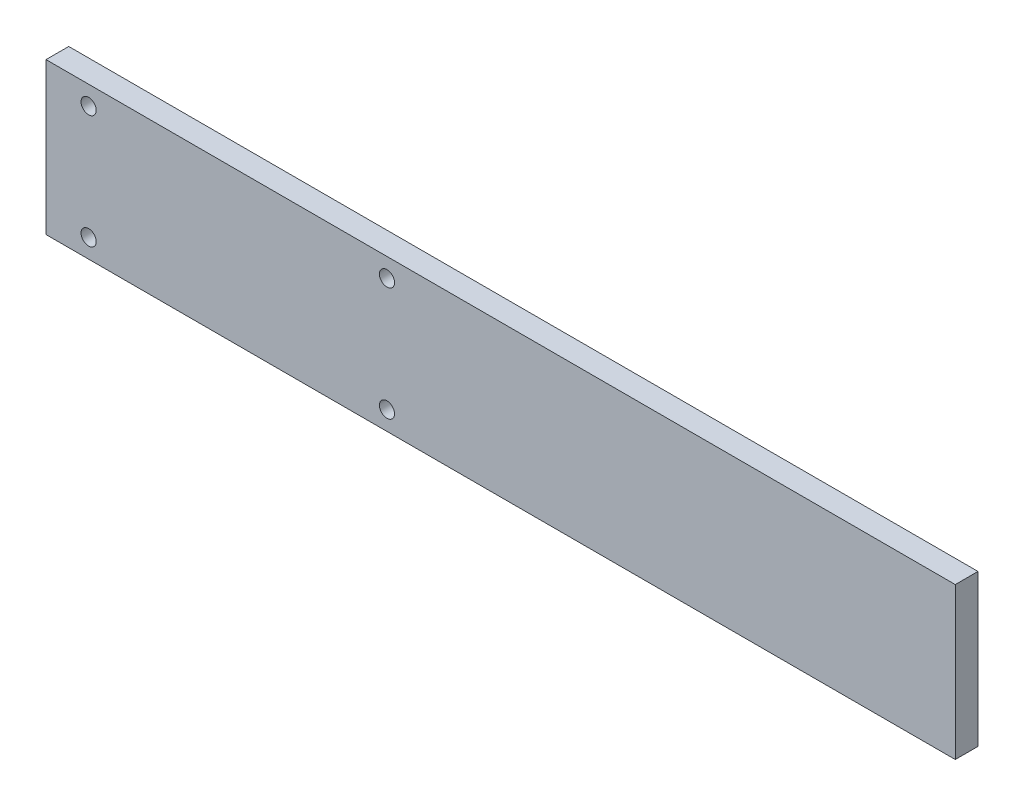
ISO-10303-21;
HEADER;
FILE_DESCRIPTION(('STEP AP214'),'2;1');
FILE_NAME('part.step','',(''),(''),'','','');
FILE_SCHEMA(('AUTOMOTIVE_DESIGN { 1 0 10303 214 1 1 1 1 }'));
ENDSEC;
DATA;
#1=APPLICATION_CONTEXT('core data for automotive mechanical design processes');
#2=APPLICATION_PROTOCOL_DEFINITION('international standard','automotive_design',2000,#1);
#3=PRODUCT_CONTEXT('',#1,'mechanical');
#4=PRODUCT('Part','Part','',(#3));
#5=PRODUCT_RELATED_PRODUCT_CATEGORY('part','',(#4));
#6=PRODUCT_DEFINITION_FORMATION('','',#4);
#7=PRODUCT_DEFINITION_CONTEXT('part definition',#1,'design');
#8=PRODUCT_DEFINITION('design','',#6,#7);
#9=PRODUCT_DEFINITION_SHAPE('','',#8);
#10=(LENGTH_UNIT() NAMED_UNIT(*) SI_UNIT(.MILLI.,.METRE.));
#11=(NAMED_UNIT(*) PLANE_ANGLE_UNIT() SI_UNIT($,.RADIAN.));
#12=(NAMED_UNIT(*) SI_UNIT($,.STERADIAN.) SOLID_ANGLE_UNIT());
#13=UNCERTAINTY_MEASURE_WITH_UNIT(LENGTH_MEASURE(1.E-05),#10,'distance_accuracy_value','');
#14=(GEOMETRIC_REPRESENTATION_CONTEXT(3) GLOBAL_UNCERTAINTY_ASSIGNED_CONTEXT((#13)) GLOBAL_UNIT_ASSIGNED_CONTEXT((#10,
#11,#12)) REPRESENTATION_CONTEXT('',''));
#15=CARTESIAN_POINT('',(0.,0.,0.));
#16=DIRECTION('',(0.,0.,1.));
#17=DIRECTION('',(1.,0.,0.));
#18=AXIS2_PLACEMENT_3D('',#15,#16,#17);
#19=CARTESIAN_POINT('',(-1524.,254.,76.2));
#20=DIRECTION('',(1.,0.,0.));
#21=DIRECTION('',(0.,0.,-1.));
#22=AXIS2_PLACEMENT_3D('',#19,#20,#21);
#23=PLANE('',#22);
#24=DIRECTION('',(0.,-1.,0.));
#25=VECTOR('',#24,1.);
#26=CARTESIAN_POINT('',(-1524.,254.,0.));
#27=LINE('',#26,#25);
#28=CARTESIAN_POINT('',(-1524.,254.,0.));
#29=VERTEX_POINT('',#28);
#30=CARTESIAN_POINT('',(-1524.,-254.,0.));
#31=VERTEX_POINT('',#30);
#32=EDGE_CURVE('E113',#29,#31,#27,.T.);
#33=ORIENTED_EDGE('',*,*,#32,.T.);
#34=DIRECTION('',(0.,0.,-1.));
#35=VECTOR('',#34,1.);
#36=CARTESIAN_POINT('',(-1524.,-254.,76.2));
#37=LINE('',#36,#35);
#38=CARTESIAN_POINT('',(-1524.,-254.,76.2));
#39=VERTEX_POINT('',#38);
#40=EDGE_CURVE('E11',#39,#31,#37,.T.);
#41=ORIENTED_EDGE('',*,*,#40,.F.);
#42=DIRECTION('',(0.,-1.,0.));
#43=VECTOR('',#42,1.);
#44=CARTESIAN_POINT('',(-1524.,254.,76.2));
#45=LINE('',#44,#43);
#46=CARTESIAN_POINT('',(-1524.,254.,76.2));
#47=VERTEX_POINT('',#46);
#48=EDGE_CURVE('E98',#47,#39,#45,.T.);
#49=ORIENTED_EDGE('',*,*,#48,.F.);
#50=DIRECTION('',(0.,0.,-1.));
#51=VECTOR('',#50,1.);
#52=CARTESIAN_POINT('',(-1524.,254.,76.2));
#53=LINE('',#52,#51);
#54=EDGE_CURVE('E112',#47,#29,#53,.T.);
#55=ORIENTED_EDGE('',*,*,#54,.T.);
#56=EDGE_LOOP('',(#33,#41,#49,#55));
#57=FACE_BOUND('',#56,.T.);
#58=ADVANCED_FACE('F50',(#57),#23,.F.);
#59=CARTESIAN_POINT('',(1524.,-254.,76.2));
#60=DIRECTION('',(0.,1.,0.));
#61=DIRECTION('',(-1.,0.,0.));
#62=AXIS2_PLACEMENT_3D('',#59,#60,#61);
#63=PLANE('',#62);
#64=DIRECTION('',(1.,0.,0.));
#65=VECTOR('',#64,1.);
#66=CARTESIAN_POINT('',(1524.,-254.,0.));
#67=LINE('',#66,#65);
#68=CARTESIAN_POINT('',(1524.,-254.,0.));
#69=VERTEX_POINT('',#68);
#70=EDGE_CURVE('E101',#31,#69,#67,.T.);
#71=ORIENTED_EDGE('',*,*,#70,.T.);
#72=DIRECTION('',(0.,0.,-1.));
#73=VECTOR('',#72,1.);
#74=CARTESIAN_POINT('',(1524.,-254.,76.2));
#75=LINE('',#74,#73);
#76=CARTESIAN_POINT('',(1524.,-254.,76.2));
#77=VERTEX_POINT('',#76);
#78=EDGE_CURVE('E57',#77,#69,#75,.T.);
#79=ORIENTED_EDGE('',*,*,#78,.F.);
#80=DIRECTION('',(1.,0.,0.));
#81=VECTOR('',#80,1.);
#82=CARTESIAN_POINT('',(1524.,-254.,76.2));
#83=LINE('',#82,#81);
#84=EDGE_CURVE('E92',#39,#77,#83,.T.);
#85=ORIENTED_EDGE('',*,*,#84,.F.);
#86=ORIENTED_EDGE('',*,*,#40,.T.);
#87=EDGE_LOOP('',(#71,#79,#85,#86));
#88=FACE_BOUND('',#87,.T.);
#89=ADVANCED_FACE('F104',(#88),#63,.F.);
#90=CARTESIAN_POINT('',(1524.,254.,76.2));
#91=DIRECTION('',(-1.,0.,0.));
#92=DIRECTION('',(0.,-1.,0.));
#93=AXIS2_PLACEMENT_3D('',#90,#91,#92);
#94=PLANE('',#93);
#95=DIRECTION('',(0.,1.,0.));
#96=VECTOR('',#95,1.);
#97=CARTESIAN_POINT('',(1524.,254.,0.));
#98=LINE('',#97,#96);
#99=CARTESIAN_POINT('',(1524.,254.,0.));
#100=VERTEX_POINT('',#99);
#101=EDGE_CURVE('E83',#69,#100,#98,.T.);
#102=ORIENTED_EDGE('',*,*,#101,.T.);
#103=DIRECTION('',(0.,0.,-1.));
#104=VECTOR('',#103,1.);
#105=CARTESIAN_POINT('',(1524.,254.,76.2));
#106=LINE('',#105,#104);
#107=CARTESIAN_POINT('',(1524.,254.,76.2));
#108=VERTEX_POINT('',#107);
#109=EDGE_CURVE('E107',#108,#100,#106,.T.);
#110=ORIENTED_EDGE('',*,*,#109,.F.);
#111=DIRECTION('',(0.,1.,0.));
#112=VECTOR('',#111,1.);
#113=CARTESIAN_POINT('',(1524.,254.,76.2));
#114=LINE('',#113,#112);
#115=EDGE_CURVE('E100',#77,#108,#114,.T.);
#116=ORIENTED_EDGE('',*,*,#115,.F.);
#117=ORIENTED_EDGE('',*,*,#78,.T.);
#118=EDGE_LOOP('',(#102,#110,#116,#117));
#119=FACE_BOUND('',#118,.T.);
#120=ADVANCED_FACE('F110',(#119),#94,.F.);
#121=CARTESIAN_POINT('',(1524.,254.,76.2));
#122=DIRECTION('',(0.,-1.,0.));
#123=DIRECTION('',(1.,0.,0.));
#124=AXIS2_PLACEMENT_3D('',#121,#122,#123);
#125=PLANE('',#124);
#126=DIRECTION('',(-1.,0.,0.));
#127=VECTOR('',#126,1.);
#128=CARTESIAN_POINT('',(1524.,254.,0.));
#129=LINE('',#128,#127);
#130=EDGE_CURVE('E90',#100,#29,#129,.T.);
#131=ORIENTED_EDGE('',*,*,#130,.T.);
#132=ORIENTED_EDGE('',*,*,#54,.F.);
#133=DIRECTION('',(-1.,0.,0.));
#134=VECTOR('',#133,1.);
#135=CARTESIAN_POINT('',(1524.,254.,76.2));
#136=LINE('',#135,#134);
#137=EDGE_CURVE('E64',#108,#47,#136,.T.);
#138=ORIENTED_EDGE('',*,*,#137,.F.);
#139=ORIENTED_EDGE('',*,*,#109,.T.);
#140=EDGE_LOOP('',(#131,#132,#138,#139));
#141=FACE_BOUND('',#140,.T.);
#142=ADVANCED_FACE('F129',(#141),#125,.F.);
#143=CARTESIAN_POINT('',(0.,0.,76.2));
#144=DIRECTION('',(0.,0.,-1.));
#145=DIRECTION('',(-1.,0.,0.));
#146=AXIS2_PLACEMENT_3D('',#143,#144,#145);
#147=PLANE('',#146);
#148=CARTESIAN_POINT('',(-1381.125,-190.5,76.2));
#149=DIRECTION('',(0.,0.,1.));
#150=DIRECTION('',(1.,0.,0.));
#151=AXIS2_PLACEMENT_3D('',#148,#149,#150);
#152=CIRCLE('',#151,25.4);
#153=CARTESIAN_POINT('',(-1355.725,-190.5,76.2));
#154=VERTEX_POINT('',#153);
#155=EDGE_CURVE('E139',#154,#154,#152,.T.);
#156=ORIENTED_EDGE('',*,*,#155,.F.);
#157=EDGE_LOOP('',(#156));
#158=FACE_BOUND('',#157,.T.);
#159=CARTESIAN_POINT('',(-381.,190.5,76.2));
#160=DIRECTION('',(0.,0.,1.));
#161=DIRECTION('',(-1.,0.,0.));
#162=AXIS2_PLACEMENT_3D('',#159,#160,#161);
#163=CIRCLE('',#162,25.4);
#164=CARTESIAN_POINT('',(-355.6,190.5,76.2));
#165=VERTEX_POINT('',#164);
#166=EDGE_CURVE('E149',#165,#165,#163,.T.);
#167=ORIENTED_EDGE('',*,*,#166,.F.);
#168=EDGE_LOOP('',(#167));
#169=FACE_BOUND('',#168,.T.);
#170=CARTESIAN_POINT('',(-1381.125,190.5,76.2));
#171=DIRECTION('',(0.,0.,1.));
#172=DIRECTION('',(-1.,0.,0.));
#173=AXIS2_PLACEMENT_3D('',#170,#171,#172);
#174=CIRCLE('',#173,25.4);
#175=CARTESIAN_POINT('',(-1355.725,190.5,76.2));
#176=VERTEX_POINT('',#175);
#177=EDGE_CURVE('E146',#176,#176,#174,.T.);
#178=ORIENTED_EDGE('',*,*,#177,.F.);
#179=EDGE_LOOP('',(#178));
#180=FACE_BOUND('',#179,.T.);
#181=CARTESIAN_POINT('',(-381.,-190.5,76.2));
#182=DIRECTION('',(0.,0.,1.));
#183=DIRECTION('',(1.,0.,0.));
#184=AXIS2_PLACEMENT_3D('',#181,#182,#183);
#185=CIRCLE('',#184,25.4);
#186=CARTESIAN_POINT('',(-355.6,-190.5,76.2));
#187=VERTEX_POINT('',#186);
#188=EDGE_CURVE('E136',#187,#187,#185,.T.);
#189=ORIENTED_EDGE('',*,*,#188,.F.);
#190=EDGE_LOOP('',(#189));
#191=FACE_BOUND('',#190,.T.);
#192=ORIENTED_EDGE('',*,*,#48,.T.);
#193=ORIENTED_EDGE('',*,*,#84,.T.);
#194=ORIENTED_EDGE('',*,*,#115,.T.);
#195=ORIENTED_EDGE('',*,*,#137,.T.);
#196=EDGE_LOOP('',(#192,#193,#194,#195));
#197=FACE_BOUND('',#196,.T.);
#198=ADVANCED_FACE('F94',(#158,#169,#180,#191,#197),#147,.F.);
#199=CARTESIAN_POINT('',(0.,0.,0.));
#200=DIRECTION('',(0.,0.,-1.));
#201=DIRECTION('',(-1.,0.,0.));
#202=AXIS2_PLACEMENT_3D('',#199,#200,#201);
#203=PLANE('',#202);
#204=CARTESIAN_POINT('',(-1381.125,-190.5,0.));
#205=DIRECTION('',(0.,0.,1.));
#206=DIRECTION('',(1.,0.,0.));
#207=AXIS2_PLACEMENT_3D('',#204,#205,#206);
#208=CIRCLE('',#207,25.4);
#209=CARTESIAN_POINT('',(-1355.725,-190.5,0.));
#210=VERTEX_POINT('',#209);
#211=EDGE_CURVE('E153',#210,#210,#208,.T.);
#212=ORIENTED_EDGE('',*,*,#211,.T.);
#213=EDGE_LOOP('',(#212));
#214=FACE_BOUND('',#213,.T.);
#215=CARTESIAN_POINT('',(-381.,190.5,0.));
#216=DIRECTION('',(0.,0.,1.));
#217=DIRECTION('',(-1.,0.,0.));
#218=AXIS2_PLACEMENT_3D('',#215,#216,#217);
#219=CIRCLE('',#218,25.4);
#220=CARTESIAN_POINT('',(-355.6,190.5,0.));
#221=VERTEX_POINT('',#220);
#222=EDGE_CURVE('E143',#221,#221,#219,.T.);
#223=ORIENTED_EDGE('',*,*,#222,.T.);
#224=EDGE_LOOP('',(#223));
#225=FACE_BOUND('',#224,.T.);
#226=CARTESIAN_POINT('',(-1381.125,190.5,0.));
#227=DIRECTION('',(0.,0.,1.));
#228=DIRECTION('',(-1.,0.,0.));
#229=AXIS2_PLACEMENT_3D('',#226,#227,#228);
#230=CIRCLE('',#229,25.4);
#231=CARTESIAN_POINT('',(-1355.725,190.5,0.));
#232=VERTEX_POINT('',#231);
#233=EDGE_CURVE('E158',#232,#232,#230,.T.);
#234=ORIENTED_EDGE('',*,*,#233,.T.);
#235=EDGE_LOOP('',(#234));
#236=FACE_BOUND('',#235,.T.);
#237=CARTESIAN_POINT('',(-381.,-190.5,0.));
#238=DIRECTION('',(0.,0.,1.));
#239=DIRECTION('',(1.,0.,0.));
#240=AXIS2_PLACEMENT_3D('',#237,#238,#239);
#241=CIRCLE('',#240,25.4);
#242=CARTESIAN_POINT('',(-355.6,-190.5,0.));
#243=VERTEX_POINT('',#242);
#244=EDGE_CURVE('E119',#243,#243,#241,.T.);
#245=ORIENTED_EDGE('',*,*,#244,.T.);
#246=EDGE_LOOP('',(#245));
#247=FACE_BOUND('',#246,.T.);
#248=ORIENTED_EDGE('',*,*,#32,.F.);
#249=ORIENTED_EDGE('',*,*,#130,.F.);
#250=ORIENTED_EDGE('',*,*,#101,.F.);
#251=ORIENTED_EDGE('',*,*,#70,.F.);
#252=EDGE_LOOP('',(#248,#249,#250,#251));
#253=FACE_BOUND('',#252,.T.);
#254=ADVANCED_FACE('F135',(#214,#225,#236,#247,#253),#203,.T.);
#255=CARTESIAN_POINT('',(-381.,-190.5,0.));
#256=DIRECTION('',(0.,0.,1.));
#257=DIRECTION('',(1.,0.,0.));
#258=AXIS2_PLACEMENT_3D('',#255,#256,#257);
#259=CYLINDRICAL_SURFACE('',#258,25.4);
#260=CARTESIAN_POINT('',(-355.6,-190.5,0.));
#261=CARTESIAN_POINT('',(-355.6,-190.5,0.79375));
#262=CARTESIAN_POINT('',(-355.6,-190.5,1.5875));
#263=CARTESIAN_POINT('',(-355.6,-190.5,3.175));
#264=CARTESIAN_POINT('',(-355.6,-190.5,3.96875));
#265=CARTESIAN_POINT('',(-355.6,-190.5,5.55625));
#266=CARTESIAN_POINT('',(-355.6,-190.5,6.35));
#267=CARTESIAN_POINT('',(-355.6,-190.5,7.9375));
#268=CARTESIAN_POINT('',(-355.6,-190.5,8.73125));
#269=CARTESIAN_POINT('',(-355.6,-190.5,10.31875));
#270=CARTESIAN_POINT('',(-355.6,-190.5,11.1125));
#271=CARTESIAN_POINT('',(-355.6,-190.5,12.7));
#272=CARTESIAN_POINT('',(-355.6,-190.5,13.49375));
#273=CARTESIAN_POINT('',(-355.6,-190.5,15.08125));
#274=CARTESIAN_POINT('',(-355.6,-190.5,15.875));
#275=CARTESIAN_POINT('',(-355.6,-190.5,17.4625));
#276=CARTESIAN_POINT('',(-355.6,-190.5,18.25625));
#277=CARTESIAN_POINT('',(-355.6,-190.5,19.84375));
#278=CARTESIAN_POINT('',(-355.6,-190.5,20.6375));
#279=CARTESIAN_POINT('',(-355.6,-190.5,22.225));
#280=CARTESIAN_POINT('',(-355.6,-190.5,23.01875));
#281=CARTESIAN_POINT('',(-355.6,-190.5,24.60625));
#282=CARTESIAN_POINT('',(-355.6,-190.5,25.4));
#283=CARTESIAN_POINT('',(-355.6,-190.5,26.9875));
#284=CARTESIAN_POINT('',(-355.6,-190.5,27.78125));
#285=CARTESIAN_POINT('',(-355.6,-190.5,29.36875));
#286=CARTESIAN_POINT('',(-355.6,-190.5,30.1625));
#287=CARTESIAN_POINT('',(-355.6,-190.5,31.75));
#288=CARTESIAN_POINT('',(-355.6,-190.5,32.54375));
#289=CARTESIAN_POINT('',(-355.6,-190.5,34.13125));
#290=CARTESIAN_POINT('',(-355.6,-190.5,34.925));
#291=CARTESIAN_POINT('',(-355.6,-190.5,36.5125));
#292=CARTESIAN_POINT('',(-355.6,-190.5,37.30625));
#293=CARTESIAN_POINT('',(-355.6,-190.5,38.89375));
#294=CARTESIAN_POINT('',(-355.6,-190.5,39.6875));
#295=CARTESIAN_POINT('',(-355.6,-190.5,41.275));
#296=CARTESIAN_POINT('',(-355.6,-190.5,42.06875));
#297=CARTESIAN_POINT('',(-355.6,-190.5,43.65625));
#298=CARTESIAN_POINT('',(-355.6,-190.5,44.45));
#299=CARTESIAN_POINT('',(-355.6,-190.5,46.0375));
#300=CARTESIAN_POINT('',(-355.6,-190.5,46.83125));
#301=CARTESIAN_POINT('',(-355.6,-190.5,48.41875));
#302=CARTESIAN_POINT('',(-355.6,-190.5,49.2125));
#303=CARTESIAN_POINT('',(-355.6,-190.5,50.8));
#304=CARTESIAN_POINT('',(-355.6,-190.5,51.59375));
#305=CARTESIAN_POINT('',(-355.6,-190.5,53.18125));
#306=CARTESIAN_POINT('',(-355.6,-190.5,53.975));
#307=CARTESIAN_POINT('',(-355.6,-190.5,55.5625));
#308=CARTESIAN_POINT('',(-355.6,-190.5,56.35625));
#309=CARTESIAN_POINT('',(-355.6,-190.5,57.94375));
#310=CARTESIAN_POINT('',(-355.6,-190.5,58.7375));
#311=CARTESIAN_POINT('',(-355.6,-190.5,60.325));
#312=CARTESIAN_POINT('',(-355.6,-190.5,61.11875));
#313=CARTESIAN_POINT('',(-355.6,-190.5,62.70625));
#314=CARTESIAN_POINT('',(-355.6,-190.5,63.5));
#315=CARTESIAN_POINT('',(-355.6,-190.5,65.0875));
#316=CARTESIAN_POINT('',(-355.6,-190.5,65.88125));
#317=CARTESIAN_POINT('',(-355.6,-190.5,67.46875));
#318=CARTESIAN_POINT('',(-355.6,-190.5,68.2625));
#319=CARTESIAN_POINT('',(-355.6,-190.5,69.85));
#320=CARTESIAN_POINT('',(-355.6,-190.5,70.64375));
#321=CARTESIAN_POINT('',(-355.6,-190.5,72.23125));
#322=CARTESIAN_POINT('',(-355.6,-190.5,73.025));
#323=CARTESIAN_POINT('',(-355.6,-190.5,74.6125));
#324=CARTESIAN_POINT('',(-355.6,-190.5,75.40625));
#325=CARTESIAN_POINT('',(-355.6,-190.5,76.2));
#326=B_SPLINE_CURVE_WITH_KNOTS('',3,(#260,#261,#262,#263,#264,#265,#266,#267,#268,#269,#270,
#271,#272,#273,#274,#275,#276,#277,#278,#279,#280,#281,#282,#283,#284,#285,#286,#287,#288,#289,
#290,#291,#292,#293,#294,#295,#296,#297,#298,#299,#300,#301,#302,#303,#304,#305,#306,#307,#308,
#309,#310,#311,#312,#313,#314,#315,#316,#317,#318,#319,#320,#321,#322,#323,#324,#325),
.UNSPECIFIED.,.F.,.F.,(4,2,2,2,2,2,2,2,2,2,2,2,2,2,2,2,2,2,2,2,2,2,2,2,2,2,2,2,2,2,2,2,4),(0.,
2.38125,4.7625,7.14375,9.525,11.90625,14.2875,16.66875,19.05,21.43125,23.8125,26.19375,28.575,
30.95625,33.3375,35.71875,38.1,40.48125,42.8625,45.24375,47.625,50.00625,52.3875,54.76875,57.15,
59.53125,61.9125,64.29375,66.675,69.05625,71.4375,73.81875,76.2),.UNSPECIFIED.);
#327=EDGE_CURVE('BSEAM176',#243,#187,#326,.T.);
#328=ORIENTED_EDGE('',*,*,#244,.F.);
#329=ORIENTED_EDGE('',*,*,#188,.T.);
#330=ORIENTED_EDGE('',*,*,#327,.T.);
#331=ORIENTED_EDGE('',*,*,#327,.F.);
#332=EDGE_LOOP('',(#328,#330,#329,#331));
#333=FACE_BOUND('',#332,.T.);
#334=ADVANCED_FACE('F176',(#333),#259,.F.);
#335=CARTESIAN_POINT('',(-1381.125,190.5,0.));
#336=DIRECTION('',(0.,0.,1.));
#337=DIRECTION('',(1.,0.,0.));
#338=AXIS2_PLACEMENT_3D('',#335,#336,#337);
#339=CYLINDRICAL_SURFACE('',#338,25.4);
#340=CARTESIAN_POINT('',(-1355.725,190.5,0.));
#341=CARTESIAN_POINT('',(-1355.725,190.5,0.79375));
#342=CARTESIAN_POINT('',(-1355.725,190.5,1.5875));
#343=CARTESIAN_POINT('',(-1355.725,190.5,3.175));
#344=CARTESIAN_POINT('',(-1355.725,190.5,3.96875));
#345=CARTESIAN_POINT('',(-1355.725,190.5,5.55625));
#346=CARTESIAN_POINT('',(-1355.725,190.5,6.35));
#347=CARTESIAN_POINT('',(-1355.725,190.5,7.9375));
#348=CARTESIAN_POINT('',(-1355.725,190.5,8.73125));
#349=CARTESIAN_POINT('',(-1355.725,190.5,10.31875));
#350=CARTESIAN_POINT('',(-1355.725,190.5,11.1125));
#351=CARTESIAN_POINT('',(-1355.725,190.5,12.7));
#352=CARTESIAN_POINT('',(-1355.725,190.5,13.49375));
#353=CARTESIAN_POINT('',(-1355.725,190.5,15.08125));
#354=CARTESIAN_POINT('',(-1355.725,190.5,15.875));
#355=CARTESIAN_POINT('',(-1355.725,190.5,17.4625));
#356=CARTESIAN_POINT('',(-1355.725,190.5,18.25625));
#357=CARTESIAN_POINT('',(-1355.725,190.5,19.84375));
#358=CARTESIAN_POINT('',(-1355.725,190.5,20.6375));
#359=CARTESIAN_POINT('',(-1355.725,190.5,22.225));
#360=CARTESIAN_POINT('',(-1355.725,190.5,23.01875));
#361=CARTESIAN_POINT('',(-1355.725,190.5,24.60625));
#362=CARTESIAN_POINT('',(-1355.725,190.5,25.4));
#363=CARTESIAN_POINT('',(-1355.725,190.5,26.9875));
#364=CARTESIAN_POINT('',(-1355.725,190.5,27.78125));
#365=CARTESIAN_POINT('',(-1355.725,190.5,29.36875));
#366=CARTESIAN_POINT('',(-1355.725,190.5,30.1625));
#367=CARTESIAN_POINT('',(-1355.725,190.5,31.75));
#368=CARTESIAN_POINT('',(-1355.725,190.5,32.54375));
#369=CARTESIAN_POINT('',(-1355.725,190.5,34.13125));
#370=CARTESIAN_POINT('',(-1355.725,190.5,34.925));
#371=CARTESIAN_POINT('',(-1355.725,190.5,36.5125));
#372=CARTESIAN_POINT('',(-1355.725,190.5,37.30625));
#373=CARTESIAN_POINT('',(-1355.725,190.5,38.89375));
#374=CARTESIAN_POINT('',(-1355.725,190.5,39.6875));
#375=CARTESIAN_POINT('',(-1355.725,190.5,41.275));
#376=CARTESIAN_POINT('',(-1355.725,190.5,42.06875));
#377=CARTESIAN_POINT('',(-1355.725,190.5,43.65625));
#378=CARTESIAN_POINT('',(-1355.725,190.5,44.45));
#379=CARTESIAN_POINT('',(-1355.725,190.5,46.0375));
#380=CARTESIAN_POINT('',(-1355.725,190.5,46.83125));
#381=CARTESIAN_POINT('',(-1355.725,190.5,48.41875));
#382=CARTESIAN_POINT('',(-1355.725,190.5,49.2125));
#383=CARTESIAN_POINT('',(-1355.725,190.5,50.8));
#384=CARTESIAN_POINT('',(-1355.725,190.5,51.59375));
#385=CARTESIAN_POINT('',(-1355.725,190.5,53.18125));
#386=CARTESIAN_POINT('',(-1355.725,190.5,53.975));
#387=CARTESIAN_POINT('',(-1355.725,190.5,55.5625));
#388=CARTESIAN_POINT('',(-1355.725,190.5,56.35625));
#389=CARTESIAN_POINT('',(-1355.725,190.5,57.94375));
#390=CARTESIAN_POINT('',(-1355.725,190.5,58.7375));
#391=CARTESIAN_POINT('',(-1355.725,190.5,60.325));
#392=CARTESIAN_POINT('',(-1355.725,190.5,61.11875));
#393=CARTESIAN_POINT('',(-1355.725,190.5,62.70625));
#394=CARTESIAN_POINT('',(-1355.725,190.5,63.5));
#395=CARTESIAN_POINT('',(-1355.725,190.5,65.0875));
#396=CARTESIAN_POINT('',(-1355.725,190.5,65.88125));
#397=CARTESIAN_POINT('',(-1355.725,190.5,67.46875));
#398=CARTESIAN_POINT('',(-1355.725,190.5,68.2625));
#399=CARTESIAN_POINT('',(-1355.725,190.5,69.85));
#400=CARTESIAN_POINT('',(-1355.725,190.5,70.64375));
#401=CARTESIAN_POINT('',(-1355.725,190.5,72.23125));
#402=CARTESIAN_POINT('',(-1355.725,190.5,73.025));
#403=CARTESIAN_POINT('',(-1355.725,190.5,74.6125));
#404=CARTESIAN_POINT('',(-1355.725,190.5,75.40625));
#405=CARTESIAN_POINT('',(-1355.725,190.5,76.2));
#406=B_SPLINE_CURVE_WITH_KNOTS('',3,(#340,#341,#342,#343,#344,#345,#346,#347,#348,#349,#350,
#351,#352,#353,#354,#355,#356,#357,#358,#359,#360,#361,#362,#363,#364,#365,#366,#367,#368,#369,
#370,#371,#372,#373,#374,#375,#376,#377,#378,#379,#380,#381,#382,#383,#384,#385,#386,#387,#388,
#389,#390,#391,#392,#393,#394,#395,#396,#397,#398,#399,#400,#401,#402,#403,#404,#405),
.UNSPECIFIED.,.F.,.F.,(4,2,2,2,2,2,2,2,2,2,2,2,2,2,2,2,2,2,2,2,2,2,2,2,2,2,2,2,2,2,2,2,4),(0.,
2.38125,4.7625,7.14375,9.525,11.90625,14.2875,16.66875,19.05,21.43125,23.8125,26.19375,28.575,
30.95625,33.3375,35.71875,38.1,40.48125,42.8625,45.24375,47.625,50.00625,52.3875,54.76875,57.15,
59.53125,61.9125,64.29375,66.675,69.05625,71.4375,73.81875,76.2),.UNSPECIFIED.);
#407=EDGE_CURVE('BSEAM166',#232,#176,#406,.T.);
#408=ORIENTED_EDGE('',*,*,#233,.F.);
#409=ORIENTED_EDGE('',*,*,#177,.T.);
#410=ORIENTED_EDGE('',*,*,#407,.T.);
#411=ORIENTED_EDGE('',*,*,#407,.F.);
#412=EDGE_LOOP('',(#408,#410,#409,#411));
#413=FACE_BOUND('',#412,.T.);
#414=ADVANCED_FACE('F166',(#413),#339,.F.);
#415=CARTESIAN_POINT('',(-381.,190.5,0.));
#416=DIRECTION('',(0.,0.,1.));
#417=DIRECTION('',(1.,0.,0.));
#418=AXIS2_PLACEMENT_3D('',#415,#416,#417);
#419=CYLINDRICAL_SURFACE('',#418,25.4);
#420=CARTESIAN_POINT('',(-355.6,190.5,0.));
#421=CARTESIAN_POINT('',(-355.6,190.5,0.79375));
#422=CARTESIAN_POINT('',(-355.6,190.5,1.5875));
#423=CARTESIAN_POINT('',(-355.6,190.5,3.175));
#424=CARTESIAN_POINT('',(-355.6,190.5,3.96875));
#425=CARTESIAN_POINT('',(-355.6,190.5,5.55625));
#426=CARTESIAN_POINT('',(-355.6,190.5,6.35));
#427=CARTESIAN_POINT('',(-355.6,190.5,7.9375));
#428=CARTESIAN_POINT('',(-355.6,190.5,8.73125));
#429=CARTESIAN_POINT('',(-355.6,190.5,10.31875));
#430=CARTESIAN_POINT('',(-355.6,190.5,11.1125));
#431=CARTESIAN_POINT('',(-355.6,190.5,12.7));
#432=CARTESIAN_POINT('',(-355.6,190.5,13.49375));
#433=CARTESIAN_POINT('',(-355.6,190.5,15.08125));
#434=CARTESIAN_POINT('',(-355.6,190.5,15.875));
#435=CARTESIAN_POINT('',(-355.6,190.5,17.4625));
#436=CARTESIAN_POINT('',(-355.6,190.5,18.25625));
#437=CARTESIAN_POINT('',(-355.6,190.5,19.84375));
#438=CARTESIAN_POINT('',(-355.6,190.5,20.6375));
#439=CARTESIAN_POINT('',(-355.6,190.5,22.225));
#440=CARTESIAN_POINT('',(-355.6,190.5,23.01875));
#441=CARTESIAN_POINT('',(-355.6,190.5,24.60625));
#442=CARTESIAN_POINT('',(-355.6,190.5,25.4));
#443=CARTESIAN_POINT('',(-355.6,190.5,26.9875));
#444=CARTESIAN_POINT('',(-355.6,190.5,27.78125));
#445=CARTESIAN_POINT('',(-355.6,190.5,29.36875));
#446=CARTESIAN_POINT('',(-355.6,190.5,30.1625));
#447=CARTESIAN_POINT('',(-355.6,190.5,31.75));
#448=CARTESIAN_POINT('',(-355.6,190.5,32.54375));
#449=CARTESIAN_POINT('',(-355.6,190.5,34.13125));
#450=CARTESIAN_POINT('',(-355.6,190.5,34.925));
#451=CARTESIAN_POINT('',(-355.6,190.5,36.5125));
#452=CARTESIAN_POINT('',(-355.6,190.5,37.30625));
#453=CARTESIAN_POINT('',(-355.6,190.5,38.89375));
#454=CARTESIAN_POINT('',(-355.6,190.5,39.6875));
#455=CARTESIAN_POINT('',(-355.6,190.5,41.275));
#456=CARTESIAN_POINT('',(-355.6,190.5,42.06875));
#457=CARTESIAN_POINT('',(-355.6,190.5,43.65625));
#458=CARTESIAN_POINT('',(-355.6,190.5,44.45));
#459=CARTESIAN_POINT('',(-355.6,190.5,46.0375));
#460=CARTESIAN_POINT('',(-355.6,190.5,46.83125));
#461=CARTESIAN_POINT('',(-355.6,190.5,48.41875));
#462=CARTESIAN_POINT('',(-355.6,190.5,49.2125));
#463=CARTESIAN_POINT('',(-355.6,190.5,50.8));
#464=CARTESIAN_POINT('',(-355.6,190.5,51.59375));
#465=CARTESIAN_POINT('',(-355.6,190.5,53.18125));
#466=CARTESIAN_POINT('',(-355.6,190.5,53.975));
#467=CARTESIAN_POINT('',(-355.6,190.5,55.5625));
#468=CARTESIAN_POINT('',(-355.6,190.5,56.35625));
#469=CARTESIAN_POINT('',(-355.6,190.5,57.94375));
#470=CARTESIAN_POINT('',(-355.6,190.5,58.7375));
#471=CARTESIAN_POINT('',(-355.6,190.5,60.325));
#472=CARTESIAN_POINT('',(-355.6,190.5,61.11875));
#473=CARTESIAN_POINT('',(-355.6,190.5,62.70625));
#474=CARTESIAN_POINT('',(-355.6,190.5,63.5));
#475=CARTESIAN_POINT('',(-355.6,190.5,65.0875));
#476=CARTESIAN_POINT('',(-355.6,190.5,65.88125));
#477=CARTESIAN_POINT('',(-355.6,190.5,67.46875));
#478=CARTESIAN_POINT('',(-355.6,190.5,68.2625));
#479=CARTESIAN_POINT('',(-355.6,190.5,69.85));
#480=CARTESIAN_POINT('',(-355.6,190.5,70.64375));
#481=CARTESIAN_POINT('',(-355.6,190.5,72.23125));
#482=CARTESIAN_POINT('',(-355.6,190.5,73.025));
#483=CARTESIAN_POINT('',(-355.6,190.5,74.6125));
#484=CARTESIAN_POINT('',(-355.6,190.5,75.40625));
#485=CARTESIAN_POINT('',(-355.6,190.5,76.2));
#486=B_SPLINE_CURVE_WITH_KNOTS('',3,(#420,#421,#422,#423,#424,#425,#426,#427,#428,#429,#430,
#431,#432,#433,#434,#435,#436,#437,#438,#439,#440,#441,#442,#443,#444,#445,#446,#447,#448,#449,
#450,#451,#452,#453,#454,#455,#456,#457,#458,#459,#460,#461,#462,#463,#464,#465,#466,#467,#468,
#469,#470,#471,#472,#473,#474,#475,#476,#477,#478,#479,#480,#481,#482,#483,#484,#485),
.UNSPECIFIED.,.F.,.F.,(4,2,2,2,2,2,2,2,2,2,2,2,2,2,2,2,2,2,2,2,2,2,2,2,2,2,2,2,2,2,2,2,4),(0.,
2.38125,4.7625,7.14375,9.525,11.90625,14.2875,16.66875,19.05,21.43125,23.8125,26.19375,28.575,
30.95625,33.3375,35.71875,38.1,40.48125,42.8625,45.24375,47.625,50.00625,52.3875,54.76875,57.15,
59.53125,61.9125,64.29375,66.675,69.05625,71.4375,73.81875,76.2),.UNSPECIFIED.);
#487=EDGE_CURVE('BSEAM182',#221,#165,#486,.T.);
#488=ORIENTED_EDGE('',*,*,#222,.F.);
#489=ORIENTED_EDGE('',*,*,#166,.T.);
#490=ORIENTED_EDGE('',*,*,#487,.T.);
#491=ORIENTED_EDGE('',*,*,#487,.F.);
#492=EDGE_LOOP('',(#488,#490,#489,#491));
#493=FACE_BOUND('',#492,.T.);
#494=ADVANCED_FACE('F182',(#493),#419,.F.);
#495=CARTESIAN_POINT('',(-1381.125,-190.5,0.));
#496=DIRECTION('',(0.,0.,1.));
#497=DIRECTION('',(1.,0.,0.));
#498=AXIS2_PLACEMENT_3D('',#495,#496,#497);
#499=CYLINDRICAL_SURFACE('',#498,25.4);
#500=CARTESIAN_POINT('',(-1355.725,-190.5,0.));
#501=CARTESIAN_POINT('',(-1355.725,-190.5,0.79375));
#502=CARTESIAN_POINT('',(-1355.725,-190.5,1.5875));
#503=CARTESIAN_POINT('',(-1355.725,-190.5,3.175));
#504=CARTESIAN_POINT('',(-1355.725,-190.5,3.96875));
#505=CARTESIAN_POINT('',(-1355.725,-190.5,5.55625));
#506=CARTESIAN_POINT('',(-1355.725,-190.5,6.35));
#507=CARTESIAN_POINT('',(-1355.725,-190.5,7.9375));
#508=CARTESIAN_POINT('',(-1355.725,-190.5,8.73125));
#509=CARTESIAN_POINT('',(-1355.725,-190.5,10.31875));
#510=CARTESIAN_POINT('',(-1355.725,-190.5,11.1125));
#511=CARTESIAN_POINT('',(-1355.725,-190.5,12.7));
#512=CARTESIAN_POINT('',(-1355.725,-190.5,13.49375));
#513=CARTESIAN_POINT('',(-1355.725,-190.5,15.08125));
#514=CARTESIAN_POINT('',(-1355.725,-190.5,15.875));
#515=CARTESIAN_POINT('',(-1355.725,-190.5,17.4625));
#516=CARTESIAN_POINT('',(-1355.725,-190.5,18.25625));
#517=CARTESIAN_POINT('',(-1355.725,-190.5,19.84375));
#518=CARTESIAN_POINT('',(-1355.725,-190.5,20.6375));
#519=CARTESIAN_POINT('',(-1355.725,-190.5,22.225));
#520=CARTESIAN_POINT('',(-1355.725,-190.5,23.01875));
#521=CARTESIAN_POINT('',(-1355.725,-190.5,24.60625));
#522=CARTESIAN_POINT('',(-1355.725,-190.5,25.4));
#523=CARTESIAN_POINT('',(-1355.725,-190.5,26.9875));
#524=CARTESIAN_POINT('',(-1355.725,-190.5,27.78125));
#525=CARTESIAN_POINT('',(-1355.725,-190.5,29.36875));
#526=CARTESIAN_POINT('',(-1355.725,-190.5,30.1625));
#527=CARTESIAN_POINT('',(-1355.725,-190.5,31.75));
#528=CARTESIAN_POINT('',(-1355.725,-190.5,32.54375));
#529=CARTESIAN_POINT('',(-1355.725,-190.5,34.13125));
#530=CARTESIAN_POINT('',(-1355.725,-190.5,34.925));
#531=CARTESIAN_POINT('',(-1355.725,-190.5,36.5125));
#532=CARTESIAN_POINT('',(-1355.725,-190.5,37.30625));
#533=CARTESIAN_POINT('',(-1355.725,-190.5,38.89375));
#534=CARTESIAN_POINT('',(-1355.725,-190.5,39.6875));
#535=CARTESIAN_POINT('',(-1355.725,-190.5,41.275));
#536=CARTESIAN_POINT('',(-1355.725,-190.5,42.06875));
#537=CARTESIAN_POINT('',(-1355.725,-190.5,43.65625));
#538=CARTESIAN_POINT('',(-1355.725,-190.5,44.45));
#539=CARTESIAN_POINT('',(-1355.725,-190.5,46.0375));
#540=CARTESIAN_POINT('',(-1355.725,-190.5,46.83125));
#541=CARTESIAN_POINT('',(-1355.725,-190.5,48.41875));
#542=CARTESIAN_POINT('',(-1355.725,-190.5,49.2125));
#543=CARTESIAN_POINT('',(-1355.725,-190.5,50.8));
#544=CARTESIAN_POINT('',(-1355.725,-190.5,51.59375));
#545=CARTESIAN_POINT('',(-1355.725,-190.5,53.18125));
#546=CARTESIAN_POINT('',(-1355.725,-190.5,53.975));
#547=CARTESIAN_POINT('',(-1355.725,-190.5,55.5625));
#548=CARTESIAN_POINT('',(-1355.725,-190.5,56.35625));
#549=CARTESIAN_POINT('',(-1355.725,-190.5,57.94375));
#550=CARTESIAN_POINT('',(-1355.725,-190.5,58.7375));
#551=CARTESIAN_POINT('',(-1355.725,-190.5,60.325));
#552=CARTESIAN_POINT('',(-1355.725,-190.5,61.11875));
#553=CARTESIAN_POINT('',(-1355.725,-190.5,62.70625));
#554=CARTESIAN_POINT('',(-1355.725,-190.5,63.5));
#555=CARTESIAN_POINT('',(-1355.725,-190.5,65.0875));
#556=CARTESIAN_POINT('',(-1355.725,-190.5,65.88125));
#557=CARTESIAN_POINT('',(-1355.725,-190.5,67.46875));
#558=CARTESIAN_POINT('',(-1355.725,-190.5,68.2625));
#559=CARTESIAN_POINT('',(-1355.725,-190.5,69.85));
#560=CARTESIAN_POINT('',(-1355.725,-190.5,70.64375));
#561=CARTESIAN_POINT('',(-1355.725,-190.5,72.23125));
#562=CARTESIAN_POINT('',(-1355.725,-190.5,73.025));
#563=CARTESIAN_POINT('',(-1355.725,-190.5,74.6125));
#564=CARTESIAN_POINT('',(-1355.725,-190.5,75.40625));
#565=CARTESIAN_POINT('',(-1355.725,-190.5,76.2));
#566=B_SPLINE_CURVE_WITH_KNOTS('',3,(#500,#501,#502,#503,#504,#505,#506,#507,#508,#509,#510,
#511,#512,#513,#514,#515,#516,#517,#518,#519,#520,#521,#522,#523,#524,#525,#526,#527,#528,#529,
#530,#531,#532,#533,#534,#535,#536,#537,#538,#539,#540,#541,#542,#543,#544,#545,#546,#547,#548,
#549,#550,#551,#552,#553,#554,#555,#556,#557,#558,#559,#560,#561,#562,#563,#564,#565),
.UNSPECIFIED.,.F.,.F.,(4,2,2,2,2,2,2,2,2,2,2,2,2,2,2,2,2,2,2,2,2,2,2,2,2,2,2,2,2,2,2,2,4),(0.,
2.38125,4.7625,7.14375,9.525,11.90625,14.2875,16.66875,19.05,21.43125,23.8125,26.19375,28.575,
30.95625,33.3375,35.71875,38.1,40.48125,42.8625,45.24375,47.625,50.00625,52.3875,54.76875,57.15,
59.53125,61.9125,64.29375,66.675,69.05625,71.4375,73.81875,76.2),.UNSPECIFIED.);
#567=EDGE_CURVE('BSEAM234',#210,#154,#566,.T.);
#568=ORIENTED_EDGE('',*,*,#211,.F.);
#569=ORIENTED_EDGE('',*,*,#155,.T.);
#570=ORIENTED_EDGE('',*,*,#567,.T.);
#571=ORIENTED_EDGE('',*,*,#567,.F.);
#572=EDGE_LOOP('',(#568,#570,#569,#571));
#573=FACE_BOUND('',#572,.T.);
#574=ADVANCED_FACE('F234',(#573),#499,.F.);
#575=CLOSED_SHELL('',(#58,#89,#120,#142,#198,#254,#334,#414,#494,#574));
#576=MANIFOLD_SOLID_BREP('B2',#575);
#577=ADVANCED_BREP_SHAPE_REPRESENTATION('',(#18,#576),#14);
#578=SHAPE_DEFINITION_REPRESENTATION(#9,#577);
ENDSEC;
END-ISO-10303-21;
